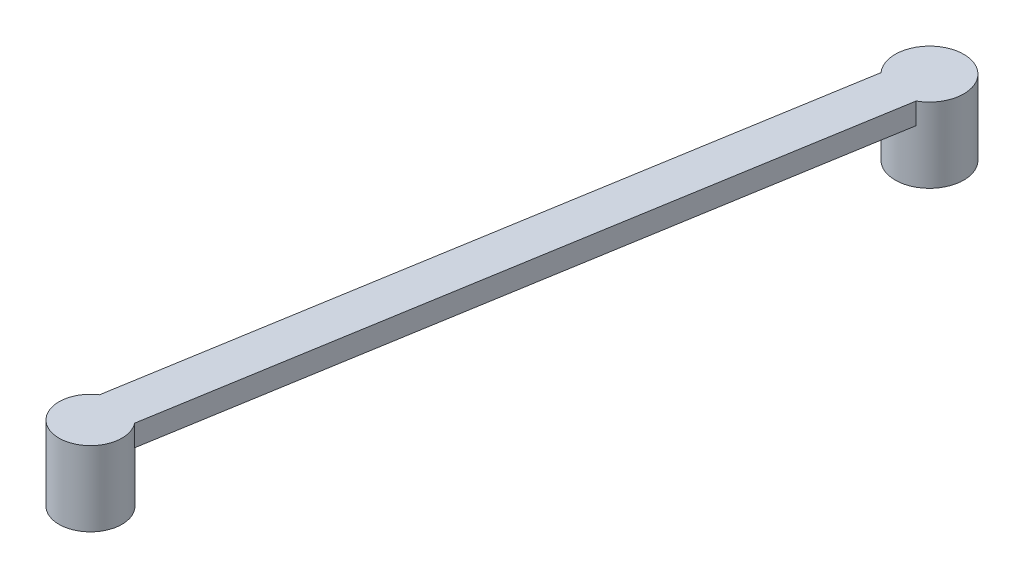
ISO-10303-21;
HEADER;
FILE_DESCRIPTION(('STEP AP214'),'2;1');
FILE_NAME('part.step','',(''),(''),'','','');
FILE_SCHEMA(('AUTOMOTIVE_DESIGN { 1 0 10303 214 1 1 1 1 }'));
ENDSEC;
DATA;
#1=APPLICATION_CONTEXT('core data for automotive mechanical design processes');
#2=APPLICATION_PROTOCOL_DEFINITION('international standard','automotive_design',2000,#1);
#3=PRODUCT_CONTEXT('',#1,'mechanical');
#4=PRODUCT('Part','Part','',(#3));
#5=PRODUCT_RELATED_PRODUCT_CATEGORY('part','',(#4));
#6=PRODUCT_DEFINITION_FORMATION('','',#4);
#7=PRODUCT_DEFINITION_CONTEXT('part definition',#1,'design');
#8=PRODUCT_DEFINITION('design','',#6,#7);
#9=PRODUCT_DEFINITION_SHAPE('','',#8);
#10=(LENGTH_UNIT() NAMED_UNIT(*) SI_UNIT(.MILLI.,.METRE.));
#11=(NAMED_UNIT(*) PLANE_ANGLE_UNIT() SI_UNIT($,.RADIAN.));
#12=(NAMED_UNIT(*) SI_UNIT($,.STERADIAN.) SOLID_ANGLE_UNIT());
#13=UNCERTAINTY_MEASURE_WITH_UNIT(LENGTH_MEASURE(1.E-05),#10,'distance_accuracy_value','');
#14=(GEOMETRIC_REPRESENTATION_CONTEXT(3) GLOBAL_UNCERTAINTY_ASSIGNED_CONTEXT((#13)) GLOBAL_UNIT_ASSIGNED_CONTEXT((#10,
#11,#12)) REPRESENTATION_CONTEXT('',''));
#15=CARTESIAN_POINT('',(0.,0.,0.));
#16=DIRECTION('',(0.,0.,1.));
#17=DIRECTION('',(1.,0.,0.));
#18=AXIS2_PLACEMENT_3D('',#15,#16,#17);
#19=CARTESIAN_POINT('',(-504.407247099574,1.,-84.1760770196559));
#20=DIRECTION('',(-0.986359590763127,0.,-0.164604853238286));
#21=DIRECTION('',(-0.164604853238286,0.,0.986359590763126));
#22=AXIS2_PLACEMENT_3D('',#19,#20,#21);
#23=PLANE('',#22);
#24=DIRECTION('',(0.164604853238286,0.,-0.986359590763127));
#25=VECTOR('',#24,1.);
#26=CARTESIAN_POINT('',(-504.407247099574,0.,-84.1760770196559));
#27=LINE('',#26,#25);
#28=CARTESIAN_POINT('',(-516.919741047889,0.,-9.19761698348769));
#29=VERTEX_POINT('',#28);
#30=CARTESIAN_POINT('',(-511.684398038291,0.,-40.5692970212317));
#31=VERTEX_POINT('',#30);
#32=EDGE_CURVE('E99',#29,#31,#27,.T.);
#33=ORIENTED_EDGE('',*,*,#32,.F.);
#34=DIRECTION('',(0.,-1.,0.));
#35=VECTOR('',#34,1.);
#36=CARTESIAN_POINT('',(-516.919741047889,1.,-9.19761698348773));
#37=LINE('',#36,#35);
#38=CARTESIAN_POINT('',(-516.919741047889,1.,-9.19761698348773));
#39=VERTEX_POINT('',#38);
#40=EDGE_CURVE('E43',#39,#29,#37,.T.);
#41=ORIENTED_EDGE('',*,*,#40,.F.);
#42=DIRECTION('',(0.164604853238286,0.,-0.986359590763127));
#43=VECTOR('',#42,1.);
#44=CARTESIAN_POINT('',(-504.407247099574,1.,-84.1760770196559));
#45=LINE('',#44,#43);
#46=CARTESIAN_POINT('',(-511.684398038291,1.,-40.5692970212316));
#47=VERTEX_POINT('',#46);
#48=EDGE_CURVE('E83',#39,#47,#45,.T.);
#49=ORIENTED_EDGE('',*,*,#48,.T.);
#50=DIRECTION('',(0.,-1.,0.));
#51=VECTOR('',#50,1.);
#52=CARTESIAN_POINT('',(-511.684398038291,1.,-40.5692970212316));
#53=LINE('',#52,#51);
#54=EDGE_CURVE('E95',#47,#31,#53,.T.);
#55=ORIENTED_EDGE('',*,*,#54,.T.);
#56=EDGE_LOOP('',(#33,#41,#49,#55));
#57=FACE_BOUND('',#56,.T.);
#58=ADVANCED_FACE('F35',(#57),#23,.T.);
#59=CARTESIAN_POINT('',(-516.111793499723,1.,-7.96391589243387));
#60=DIRECTION('',(0.,-1.,0.));
#61=DIRECTION('',(0.,0.,-1.));
#62=AXIS2_PLACEMENT_3D('',#59,#60,#61);
#63=CYLINDRICAL_SURFACE('',#62,1.47471950643337);
#64=ORIENTED_EDGE('',*,*,#40,.T.);
#65=CARTESIAN_POINT('',(-516.111793499723,0.,-7.96391589243387));
#66=DIRECTION('',(0.,1.,0.));
#67=DIRECTION('',(0.,0.,1.));
#68=AXIS2_PLACEMENT_3D('',#65,#66,#67);
#69=CIRCLE('',#68,1.47471950643337);
#70=CARTESIAN_POINT('',(-514.947021866362,0.,-8.86840727701116));
#71=VERTEX_POINT('',#70);
#72=EDGE_CURVE('E63',#71,#29,#69,.T.);
#73=ORIENTED_EDGE('',*,*,#72,.F.);
#74=DIRECTION('',(0.,-1.,0.));
#75=VECTOR('',#74,1.);
#76=CARTESIAN_POINT('',(-514.947021866362,1.,-8.86840727701116));
#77=LINE('',#76,#75);
#78=CARTESIAN_POINT('',(-514.947021866362,1.,-8.86840727701116));
#79=VERTEX_POINT('',#78);
#80=EDGE_CURVE('E85',#79,#71,#77,.T.);
#81=ORIENTED_EDGE('',*,*,#80,.F.);
#82=CARTESIAN_POINT('',(-516.111793499723,1.,-7.96391589243387));
#83=DIRECTION('',(0.,1.,0.));
#84=DIRECTION('',(0.,0.,1.));
#85=AXIS2_PLACEMENT_3D('',#82,#83,#84);
#86=CIRCLE('',#85,1.47471950643337);
#87=EDGE_CURVE('E77',#39,#79,#86,.T.);
#88=ORIENTED_EDGE('',*,*,#87,.F.);
#89=EDGE_LOOP('',(#64,#73,#81,#88));
#90=FACE_BOUND('',#89,.T.);
#91=CARTESIAN_POINT('',(-516.111793499723,-2.5,-7.96391589243387));
#92=DIRECTION('',(0.,1.,0.));
#93=DIRECTION('',(0.,0.,1.));
#94=AXIS2_PLACEMENT_3D('',#91,#92,#93);
#95=CIRCLE('',#94,1.47471950643337);
#96=CARTESIAN_POINT('',(-516.111793499723,-2.5,-6.48919638600049));
#97=VERTEX_POINT('',#96);
#98=EDGE_CURVE('E102',#97,#97,#95,.T.);
#99=ORIENTED_EDGE('',*,*,#98,.T.);
#100=EDGE_LOOP('',(#99));
#101=FACE_BOUND('',#100,.T.);
#102=ADVANCED_FACE('F86',(#90,#101),#63,.T.);
#103=CARTESIAN_POINT('',(-502.434527918047,1.,-83.8468673131793));
#104=DIRECTION('',(-0.986359590763127,0.,-0.164604853238286));
#105=DIRECTION('',(-0.164604853238286,0.,0.986359590763126));
#106=AXIS2_PLACEMENT_3D('',#103,#104,#105);
#107=PLANE('',#106);
#108=DIRECTION('',(0.164604853238286,0.,-0.986359590763127));
#109=VECTOR('',#108,1.);
#110=CARTESIAN_POINT('',(-502.434527918047,0.,-83.8468673131793));
#111=LINE('',#110,#109);
#112=CARTESIAN_POINT('',(-509.711678856765,0.,-40.240087314755));
#113=VERTEX_POINT('',#112);
#114=EDGE_CURVE('E101',#71,#113,#111,.T.);
#115=ORIENTED_EDGE('',*,*,#114,.T.);
#116=DIRECTION('',(0.,-1.,0.));
#117=VECTOR('',#116,1.);
#118=CARTESIAN_POINT('',(-509.711678856765,1.,-40.240087314755));
#119=LINE('',#118,#117);
#120=CARTESIAN_POINT('',(-509.711678856765,1.,-40.240087314755));
#121=VERTEX_POINT('',#120);
#122=EDGE_CURVE('E90',#121,#113,#119,.T.);
#123=ORIENTED_EDGE('',*,*,#122,.F.);
#124=DIRECTION('',(0.164604853238286,0.,-0.986359590763127));
#125=VECTOR('',#124,1.);
#126=CARTESIAN_POINT('',(-502.434527918047,1.,-83.8468673131793));
#127=LINE('',#126,#125);
#128=EDGE_CURVE('E80',#79,#121,#127,.T.);
#129=ORIENTED_EDGE('',*,*,#128,.F.);
#130=ORIENTED_EDGE('',*,*,#80,.T.);
#131=EDGE_LOOP('',(#115,#123,#129,#130));
#132=FACE_BOUND('',#131,.T.);
#133=ADVANCED_FACE('F92',(#132),#107,.F.);
#134=CARTESIAN_POINT('',(-510.491081649442,1.,-41.6448367849359));
#135=DIRECTION('',(0.,-1.,0.));
#136=DIRECTION('',(0.,0.,-1.));
#137=AXIS2_PLACEMENT_3D('',#134,#135,#136);
#138=CYLINDRICAL_SURFACE('',#137,1.60648367162756);
#139=ORIENTED_EDGE('',*,*,#122,.T.);
#140=CARTESIAN_POINT('',(-510.491081649442,0.,-41.6448367849359));
#141=DIRECTION('',(0.,1.,0.));
#142=DIRECTION('',(0.,0.,1.));
#143=AXIS2_PLACEMENT_3D('',#140,#141,#142);
#144=CIRCLE('',#143,1.60648367162756);
#145=EDGE_CURVE('E11',#31,#113,#144,.T.);
#146=ORIENTED_EDGE('',*,*,#145,.F.);
#147=ORIENTED_EDGE('',*,*,#54,.F.);
#148=CARTESIAN_POINT('',(-510.491081649442,1.,-41.6448367849359));
#149=DIRECTION('',(0.,1.,0.));
#150=DIRECTION('',(0.,0.,1.));
#151=AXIS2_PLACEMENT_3D('',#148,#149,#150);
#152=CIRCLE('',#151,1.60648367162756);
#153=EDGE_CURVE('E51',#121,#47,#152,.T.);
#154=ORIENTED_EDGE('',*,*,#153,.F.);
#155=EDGE_LOOP('',(#139,#146,#147,#154));
#156=FACE_BOUND('',#155,.T.);
#157=CARTESIAN_POINT('',(-510.491081649442,-2.5,-41.6448367849359));
#158=DIRECTION('',(0.,1.,0.));
#159=DIRECTION('',(0.,0.,1.));
#160=AXIS2_PLACEMENT_3D('',#157,#158,#159);
#161=CIRCLE('',#160,1.60648367162756);
#162=CARTESIAN_POINT('',(-510.491081649442,-2.5,-40.0383531133084));
#163=VERTEX_POINT('',#162);
#164=EDGE_CURVE('E114',#163,#163,#161,.T.);
#165=ORIENTED_EDGE('',*,*,#164,.T.);
#166=EDGE_LOOP('',(#165));
#167=FACE_BOUND('',#166,.T.);
#168=ADVANCED_FACE('F110',(#156,#167),#138,.T.);
#169=CARTESIAN_POINT('',(0.,1.,0.));
#170=DIRECTION('',(0.,1.,0.));
#171=DIRECTION('',(0.,0.,1.));
#172=AXIS2_PLACEMENT_3D('',#169,#170,#171);
#173=PLANE('',#172);
#174=ORIENTED_EDGE('',*,*,#48,.F.);
#175=ORIENTED_EDGE('',*,*,#87,.T.);
#176=ORIENTED_EDGE('',*,*,#128,.T.);
#177=ORIENTED_EDGE('',*,*,#153,.T.);
#178=EDGE_LOOP('',(#174,#175,#176,#177));
#179=FACE_BOUND('',#178,.T.);
#180=ADVANCED_FACE('F78',(#179),#173,.T.);
#181=CARTESIAN_POINT('',(0.,0.,0.));
#182=DIRECTION('',(0.,1.,0.));
#183=DIRECTION('',(0.,0.,1.));
#184=AXIS2_PLACEMENT_3D('',#181,#182,#183);
#185=PLANE('',#184);
#186=ORIENTED_EDGE('',*,*,#32,.T.);
#187=ORIENTED_EDGE('',*,*,#145,.T.);
#188=ORIENTED_EDGE('',*,*,#114,.F.);
#189=ORIENTED_EDGE('',*,*,#72,.T.);
#190=EDGE_LOOP('',(#186,#187,#188,#189));
#191=FACE_BOUND('',#190,.T.);
#192=ADVANCED_FACE('F108',(#191),#185,.F.);
#193=CARTESIAN_POINT('',(0.,-2.5,0.));
#194=DIRECTION('',(0.,1.,0.));
#195=DIRECTION('',(0.,0.,1.));
#196=AXIS2_PLACEMENT_3D('',#193,#194,#195);
#197=PLANE('',#196);
#198=ORIENTED_EDGE('',*,*,#98,.F.);
#199=EDGE_LOOP('',(#198));
#200=FACE_BOUND('',#199,.T.);
#201=ADVANCED_FACE('F122',(#200),#197,.F.);
#202=CARTESIAN_POINT('',(0.,-2.5,0.));
#203=DIRECTION('',(0.,1.,0.));
#204=DIRECTION('',(0.,0.,1.));
#205=AXIS2_PLACEMENT_3D('',#202,#203,#204);
#206=PLANE('',#205);
#207=ORIENTED_EDGE('',*,*,#164,.F.);
#208=EDGE_LOOP('',(#207));
#209=FACE_BOUND('',#208,.T.);
#210=ADVANCED_FACE('F120',(#209),#206,.F.);
#211=CLOSED_SHELL('',(#58,#102,#133,#168,#180,#192,#201,#210));
#212=MANIFOLD_SOLID_BREP('B2',#211);
#213=ADVANCED_BREP_SHAPE_REPRESENTATION('',(#18,#212),#14);
#214=SHAPE_DEFINITION_REPRESENTATION(#9,#213);
ENDSEC;
END-ISO-10303-21;
